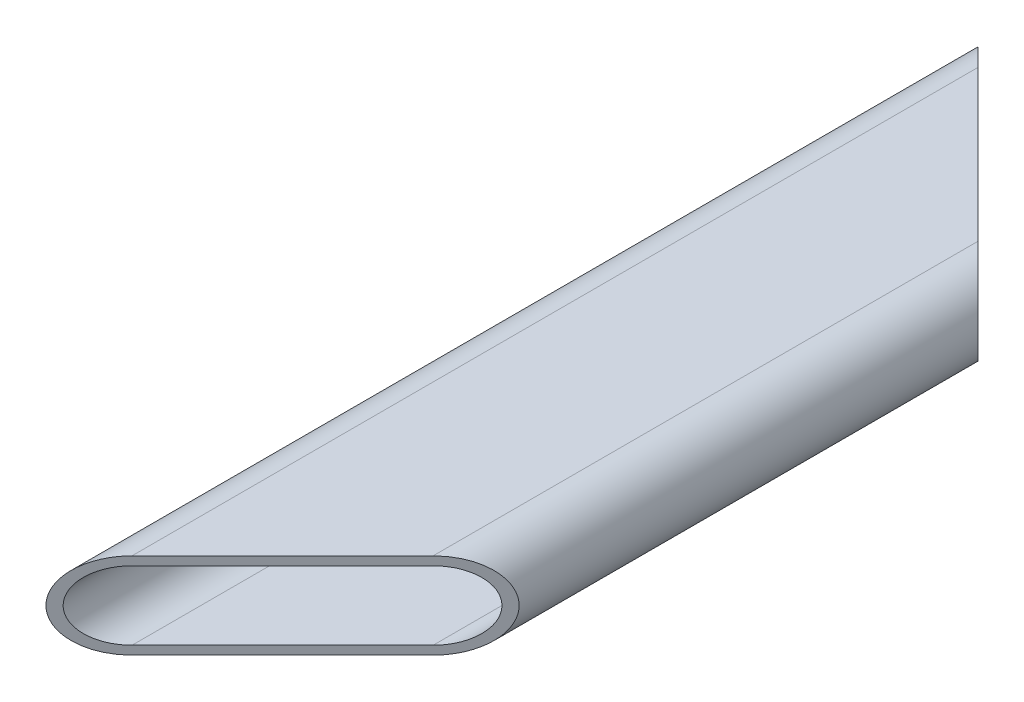
ISO-10303-21;
HEADER;
FILE_DESCRIPTION(('STEP AP214'),'2;1');
FILE_NAME('part.step','',(''),(''),'','','');
FILE_SCHEMA(('AUTOMOTIVE_DESIGN { 1 0 10303 214 1 1 1 1 }'));
ENDSEC;
DATA;
#1=APPLICATION_CONTEXT('core data for automotive mechanical design processes');
#2=APPLICATION_PROTOCOL_DEFINITION('international standard','automotive_design',2000,#1);
#3=PRODUCT_CONTEXT('',#1,'mechanical');
#4=PRODUCT('Part','Part','',(#3));
#5=PRODUCT_RELATED_PRODUCT_CATEGORY('part','',(#4));
#6=PRODUCT_DEFINITION_FORMATION('','',#4);
#7=PRODUCT_DEFINITION_CONTEXT('part definition',#1,'design');
#8=PRODUCT_DEFINITION('design','',#6,#7);
#9=PRODUCT_DEFINITION_SHAPE('','',#8);
#10=(LENGTH_UNIT() NAMED_UNIT(*) SI_UNIT(.MILLI.,.METRE.));
#11=(NAMED_UNIT(*) PLANE_ANGLE_UNIT() SI_UNIT($,.RADIAN.));
#12=(NAMED_UNIT(*) SI_UNIT($,.STERADIAN.) SOLID_ANGLE_UNIT());
#13=UNCERTAINTY_MEASURE_WITH_UNIT(LENGTH_MEASURE(1.E-05),#10,'distance_accuracy_value','');
#14=(GEOMETRIC_REPRESENTATION_CONTEXT(3) GLOBAL_UNCERTAINTY_ASSIGNED_CONTEXT((#13)) GLOBAL_UNIT_ASSIGNED_CONTEXT((#10,
#11,#12)) REPRESENTATION_CONTEXT('',''));
#15=CARTESIAN_POINT('',(0.,0.,0.));
#16=DIRECTION('',(0.,0.,1.));
#17=DIRECTION('',(1.,0.,0.));
#18=AXIS2_PLACEMENT_3D('',#15,#16,#17);
#19=CARTESIAN_POINT('',(0.,0.,130.));
#20=DIRECTION('',(0.,0.,-1.));
#21=DIRECTION('',(-1.,0.,0.));
#22=AXIS2_PLACEMENT_3D('',#19,#20,#21);
#23=CYLINDRICAL_SURFACE('',#22,6.);
#24=DIRECTION('',(0.,0.,-1.));
#25=VECTOR('',#24,1.);
#26=CARTESIAN_POINT('',(0.,-6.,130.));
#27=LINE('',#26,#25);
#28=CARTESIAN_POINT('',(0.,-6.,124.));
#29=VERTEX_POINT('',#28);
#30=CARTESIAN_POINT('',(0.,-6.,5.99999999999991));
#31=VERTEX_POINT('',#30);
#32=EDGE_CURVE('E101',#29,#31,#27,.T.);
#33=ORIENTED_EDGE('',*,*,#32,.F.);
#34=CARTESIAN_POINT('',(0.,0.,124.));
#35=DIRECTION('',(-0.707106781186544,0.,-0.707106781186551));
#36=DIRECTION('',(0.707106781186551,0.,-0.707106781186544));
#37=AXIS2_PLACEMENT_3D('',#34,#35,#36);
#38=ELLIPSE('',#37,8.48528137423853,6.);
#39=CARTESIAN_POINT('',(0.,6.,124.));
#40=VERTEX_POINT('',#39);
#41=EDGE_CURVE('E96',#29,#40,#38,.T.);
#42=ORIENTED_EDGE('',*,*,#41,.T.);
#43=DIRECTION('',(0.,0.,-1.));
#44=VECTOR('',#43,1.);
#45=CARTESIAN_POINT('',(0.,6.,130.));
#46=LINE('',#45,#44);
#47=CARTESIAN_POINT('',(0.,6.,5.99999999999993));
#48=VERTEX_POINT('',#47);
#49=EDGE_CURVE('E99',#40,#48,#46,.T.);
#50=ORIENTED_EDGE('',*,*,#49,.T.);
#51=CARTESIAN_POINT('',(0.,0.,5.99999999999992));
#52=DIRECTION('',(-0.707106781186543,0.,0.707106781186551));
#53=DIRECTION('',(-0.707106781186552,0.,-0.707106781186544));
#54=AXIS2_PLACEMENT_3D('',#51,#52,#53);
#55=ELLIPSE('',#54,8.48528137423852,6.);
#56=EDGE_CURVE('E156',#48,#31,#55,.T.);
#57=ORIENTED_EDGE('',*,*,#56,.T.);
#58=EDGE_LOOP('',(#33,#42,#50,#57));
#59=FACE_BOUND('',#58,.T.);
#60=ADVANCED_FACE('F33',(#59),#23,.T.);
#61=CARTESIAN_POINT('',(0.,-6.,130.));
#62=DIRECTION('',(0.,1.,0.));
#63=DIRECTION('',(0.,0.,1.));
#64=AXIS2_PLACEMENT_3D('',#61,#62,#63);
#65=PLANE('',#64);
#66=DIRECTION('',(0.,0.,-1.));
#67=VECTOR('',#66,1.);
#68=CARTESIAN_POINT('',(21.,-6.,130.));
#69=LINE('',#68,#67);
#70=CARTESIAN_POINT('',(21.,-6.,103.));
#71=VERTEX_POINT('',#70);
#72=CARTESIAN_POINT('',(21.,-6.,26.9999999999997));
#73=VERTEX_POINT('',#72);
#74=EDGE_CURVE('E118',#71,#73,#69,.T.);
#75=ORIENTED_EDGE('',*,*,#74,.F.);
#76=DIRECTION('',(-0.707106781186551,0.,0.707106781186544));
#77=VECTOR('',#76,1.);
#78=CARTESIAN_POINT('',(-2.99999999999997,-6.,127.));
#79=LINE('',#78,#77);
#80=EDGE_CURVE('E104',#71,#29,#79,.T.);
#81=ORIENTED_EDGE('',*,*,#80,.T.);
#82=ORIENTED_EDGE('',*,*,#32,.T.);
#83=DIRECTION('',(0.707106781186552,0.,0.707106781186544));
#84=VECTOR('',#83,1.);
#85=CARTESIAN_POINT('',(62.,-6.,67.9999999999993));
#86=LINE('',#85,#84);
#87=EDGE_CURVE('E149',#31,#73,#86,.T.);
#88=ORIENTED_EDGE('',*,*,#87,.T.);
#89=EDGE_LOOP('',(#75,#81,#82,#88));
#90=FACE_BOUND('',#89,.T.);
#91=ADVANCED_FACE('F184',(#90),#65,.F.);
#92=CARTESIAN_POINT('',(21.,0.,130.));
#93=DIRECTION('',(0.,0.,-1.));
#94=DIRECTION('',(-1.,0.,0.));
#95=AXIS2_PLACEMENT_3D('',#92,#93,#94);
#96=CYLINDRICAL_SURFACE('',#95,6.);
#97=CARTESIAN_POINT('',(21.,0.,103.));
#98=DIRECTION('',(-0.707106781186544,0.,-0.707106781186551));
#99=DIRECTION('',(0.707106781186551,0.,-0.707106781186544));
#100=AXIS2_PLACEMENT_3D('',#97,#98,#99);
#101=ELLIPSE('',#100,8.48528137423853,6.);
#102=CARTESIAN_POINT('',(21.,6.,103.));
#103=VERTEX_POINT('',#102);
#104=EDGE_CURVE('E47',#103,#71,#101,.T.);
#105=ORIENTED_EDGE('',*,*,#104,.T.);
#106=ORIENTED_EDGE('',*,*,#74,.T.);
#107=CARTESIAN_POINT('',(21.,0.,26.9999999999997));
#108=DIRECTION('',(-0.707106781186543,0.,0.707106781186551));
#109=DIRECTION('',(-0.707106781186552,0.,-0.707106781186544));
#110=AXIS2_PLACEMENT_3D('',#107,#108,#109);
#111=ELLIPSE('',#110,8.48528137423852,6.);
#112=CARTESIAN_POINT('',(21.,6.,26.9999999999997));
#113=VERTEX_POINT('',#112);
#114=EDGE_CURVE('E145',#73,#113,#111,.T.);
#115=ORIENTED_EDGE('',*,*,#114,.T.);
#116=DIRECTION('',(0.,0.,-1.));
#117=VECTOR('',#116,1.);
#118=CARTESIAN_POINT('',(21.,6.,130.));
#119=LINE('',#118,#117);
#120=EDGE_CURVE('E115',#103,#113,#119,.T.);
#121=ORIENTED_EDGE('',*,*,#120,.F.);
#122=EDGE_LOOP('',(#105,#106,#115,#121));
#123=FACE_BOUND('',#122,.T.);
#124=ADVANCED_FACE('F188',(#123),#96,.T.);
#125=CARTESIAN_POINT('',(0.,6.,130.));
#126=DIRECTION('',(0.,-1.,0.));
#127=DIRECTION('',(0.,0.,-1.));
#128=AXIS2_PLACEMENT_3D('',#125,#126,#127);
#129=PLANE('',#128);
#130=ORIENTED_EDGE('',*,*,#49,.F.);
#131=DIRECTION('',(-0.707106781186551,0.,0.707106781186544));
#132=VECTOR('',#131,1.);
#133=CARTESIAN_POINT('',(-6.,6.,130.));
#134=LINE('',#133,#132);
#135=EDGE_CURVE('E106',#103,#40,#134,.T.);
#136=ORIENTED_EDGE('',*,*,#135,.F.);
#137=ORIENTED_EDGE('',*,*,#120,.T.);
#138=DIRECTION('',(0.707106781186551,0.,0.707106781186543));
#139=VECTOR('',#138,1.);
#140=CARTESIAN_POINT('',(-6.,6.,0.));
#141=LINE('',#140,#139);
#142=EDGE_CURVE('E103',#48,#113,#141,.T.);
#143=ORIENTED_EDGE('',*,*,#142,.F.);
#144=EDGE_LOOP('',(#130,#136,#137,#143));
#145=FACE_BOUND('',#144,.T.);
#146=ADVANCED_FACE('F113',(#145),#129,.F.);
#147=CARTESIAN_POINT('',(0.,0.,130.));
#148=DIRECTION('',(0.,0.,-1.));
#149=DIRECTION('',(-1.,0.,0.));
#150=AXIS2_PLACEMENT_3D('',#147,#148,#149);
#151=CYLINDRICAL_SURFACE('',#150,4.8);
#152=CARTESIAN_POINT('',(0.,0.,124.));
#153=DIRECTION('',(-0.707106781186544,0.,-0.707106781186551));
#154=DIRECTION('',(0.707106781186551,0.,-0.707106781186544));
#155=AXIS2_PLACEMENT_3D('',#152,#153,#154);
#156=ELLIPSE('',#155,6.78822509939082,4.8);
#157=CARTESIAN_POINT('',(0.,-4.8,124.));
#158=VERTEX_POINT('',#157);
#159=CARTESIAN_POINT('',(0.,4.8,124.));
#160=VERTEX_POINT('',#159);
#161=EDGE_CURVE('E54',#158,#160,#156,.T.);
#162=ORIENTED_EDGE('',*,*,#161,.F.);
#163=DIRECTION('',(0.,0.,-1.));
#164=VECTOR('',#163,1.);
#165=CARTESIAN_POINT('',(0.,-4.8,130.));
#166=LINE('',#165,#164);
#167=CARTESIAN_POINT('',(0.,-4.8,5.99999999999991));
#168=VERTEX_POINT('',#167);
#169=EDGE_CURVE('E116',#158,#168,#166,.T.);
#170=ORIENTED_EDGE('',*,*,#169,.T.);
#171=CARTESIAN_POINT('',(0.,0.,5.99999999999992));
#172=DIRECTION('',(-0.707106781186543,0.,0.707106781186551));
#173=DIRECTION('',(-0.707106781186552,0.,-0.707106781186544));
#174=AXIS2_PLACEMENT_3D('',#171,#172,#173);
#175=ELLIPSE('',#174,6.78822509939082,4.8);
#176=CARTESIAN_POINT('',(0.,4.8,5.99999999999991));
#177=VERTEX_POINT('',#176);
#178=EDGE_CURVE('E134',#177,#168,#175,.T.);
#179=ORIENTED_EDGE('',*,*,#178,.F.);
#180=DIRECTION('',(0.,0.,-1.));
#181=VECTOR('',#180,1.);
#182=CARTESIAN_POINT('',(0.,4.8,130.));
#183=LINE('',#182,#181);
#184=EDGE_CURVE('E143',#160,#177,#183,.T.);
#185=ORIENTED_EDGE('',*,*,#184,.F.);
#186=EDGE_LOOP('',(#162,#170,#179,#185));
#187=FACE_BOUND('',#186,.T.);
#188=ADVANCED_FACE('F142',(#187),#151,.F.);
#189=CARTESIAN_POINT('',(0.,-4.8,130.));
#190=DIRECTION('',(0.,1.,0.));
#191=DIRECTION('',(0.,0.,1.));
#192=AXIS2_PLACEMENT_3D('',#189,#190,#191);
#193=PLANE('',#192);
#194=DIRECTION('',(-0.707106781186551,0.,0.707106781186544));
#195=VECTOR('',#194,1.);
#196=CARTESIAN_POINT('',(-2.99999999999997,-4.8,127.));
#197=LINE('',#196,#195);
#198=CARTESIAN_POINT('',(21.,-4.8,103.));
#199=VERTEX_POINT('',#198);
#200=EDGE_CURVE('E164',#199,#158,#197,.T.);
#201=ORIENTED_EDGE('',*,*,#200,.F.);
#202=DIRECTION('',(0.,0.,-1.));
#203=VECTOR('',#202,1.);
#204=CARTESIAN_POINT('',(21.,-4.8,130.));
#205=LINE('',#204,#203);
#206=CARTESIAN_POINT('',(21.,-4.8,26.9999999999997));
#207=VERTEX_POINT('',#206);
#208=EDGE_CURVE('E120',#199,#207,#205,.T.);
#209=ORIENTED_EDGE('',*,*,#208,.T.);
#210=DIRECTION('',(0.707106781186552,0.,0.707106781186544));
#211=VECTOR('',#210,1.);
#212=CARTESIAN_POINT('',(62.,-4.8,67.9999999999993));
#213=LINE('',#212,#211);
#214=EDGE_CURVE('E146',#168,#207,#213,.T.);
#215=ORIENTED_EDGE('',*,*,#214,.F.);
#216=ORIENTED_EDGE('',*,*,#169,.F.);
#217=EDGE_LOOP('',(#201,#209,#215,#216));
#218=FACE_BOUND('',#217,.T.);
#219=ADVANCED_FACE('F163',(#218),#193,.T.);
#220=CARTESIAN_POINT('',(21.,0.,130.));
#221=DIRECTION('',(0.,0.,-1.));
#222=DIRECTION('',(-1.,0.,0.));
#223=AXIS2_PLACEMENT_3D('',#220,#221,#222);
#224=CYLINDRICAL_SURFACE('',#223,4.8);
#225=CARTESIAN_POINT('',(21.,0.,103.));
#226=DIRECTION('',(-0.707106781186544,0.,-0.707106781186551));
#227=DIRECTION('',(0.707106781186551,0.,-0.707106781186544));
#228=AXIS2_PLACEMENT_3D('',#225,#226,#227);
#229=ELLIPSE('',#228,6.78822509939082,4.8);
#230=CARTESIAN_POINT('',(21.,4.8,103.));
#231=VERTEX_POINT('',#230);
#232=EDGE_CURVE('E110',#231,#199,#229,.T.);
#233=ORIENTED_EDGE('',*,*,#232,.F.);
#234=DIRECTION('',(0.,0.,-1.));
#235=VECTOR('',#234,1.);
#236=CARTESIAN_POINT('',(21.,4.8,130.));
#237=LINE('',#236,#235);
#238=CARTESIAN_POINT('',(21.,4.8,26.9999999999997));
#239=VERTEX_POINT('',#238);
#240=EDGE_CURVE('E159',#231,#239,#237,.T.);
#241=ORIENTED_EDGE('',*,*,#240,.T.);
#242=CARTESIAN_POINT('',(21.,0.,26.9999999999997));
#243=DIRECTION('',(-0.707106781186543,0.,0.707106781186551));
#244=DIRECTION('',(-0.707106781186552,0.,-0.707106781186544));
#245=AXIS2_PLACEMENT_3D('',#242,#243,#244);
#246=ELLIPSE('',#245,6.78822509939082,4.8);
#247=EDGE_CURVE('E137',#207,#239,#246,.T.);
#248=ORIENTED_EDGE('',*,*,#247,.F.);
#249=ORIENTED_EDGE('',*,*,#208,.F.);
#250=EDGE_LOOP('',(#233,#241,#248,#249));
#251=FACE_BOUND('',#250,.T.);
#252=ADVANCED_FACE('F167',(#251),#224,.F.);
#253=CARTESIAN_POINT('',(0.,4.8,130.));
#254=DIRECTION('',(0.,-1.,0.));
#255=DIRECTION('',(0.,0.,-1.));
#256=AXIS2_PLACEMENT_3D('',#253,#254,#255);
#257=PLANE('',#256);
#258=DIRECTION('',(0.707106781186551,0.,-0.707106781186544));
#259=VECTOR('',#258,1.);
#260=CARTESIAN_POINT('',(-2.99999999999997,4.8,127.));
#261=LINE('',#260,#259);
#262=EDGE_CURVE('E11',#160,#231,#261,.T.);
#263=ORIENTED_EDGE('',*,*,#262,.F.);
#264=ORIENTED_EDGE('',*,*,#184,.T.);
#265=DIRECTION('',(-0.707106781186552,0.,-0.707106781186544));
#266=VECTOR('',#265,1.);
#267=CARTESIAN_POINT('',(62.,4.8,67.9999999999993));
#268=LINE('',#267,#266);
#269=EDGE_CURVE('E40',#239,#177,#268,.T.);
#270=ORIENTED_EDGE('',*,*,#269,.F.);
#271=ORIENTED_EDGE('',*,*,#240,.F.);
#272=EDGE_LOOP('',(#263,#264,#270,#271));
#273=FACE_BOUND('',#272,.T.);
#274=ADVANCED_FACE('F174',(#273),#257,.T.);
#275=CARTESIAN_POINT('',(-6.,-24.,0.));
#276=DIRECTION('',(-0.707106781186543,0.,0.707106781186551));
#277=DIRECTION('',(0.707106781186552,0.,0.707106781186544));
#278=AXIS2_PLACEMENT_3D('',#275,#276,#277);
#279=PLANE('',#278);
#280=ORIENTED_EDGE('',*,*,#178,.T.);
#281=ORIENTED_EDGE('',*,*,#214,.T.);
#282=ORIENTED_EDGE('',*,*,#247,.T.);
#283=ORIENTED_EDGE('',*,*,#269,.T.);
#284=EDGE_LOOP('',(#280,#281,#282,#283));
#285=FACE_BOUND('',#284,.T.);
#286=ORIENTED_EDGE('',*,*,#142,.T.);
#287=ORIENTED_EDGE('',*,*,#114,.F.);
#288=ORIENTED_EDGE('',*,*,#87,.F.);
#289=ORIENTED_EDGE('',*,*,#56,.F.);
#290=EDGE_LOOP('',(#286,#287,#288,#289));
#291=FACE_BOUND('',#290,.T.);
#292=ADVANCED_FACE('F131',(#285,#291),#279,.F.);
#293=CARTESIAN_POINT('',(-6.,-24.,130.));
#294=DIRECTION('',(-0.707106781186544,0.,-0.707106781186551));
#295=DIRECTION('',(-0.707106781186551,0.,0.707106781186544));
#296=AXIS2_PLACEMENT_3D('',#293,#294,#295);
#297=PLANE('',#296);
#298=ORIENTED_EDGE('',*,*,#161,.T.);
#299=ORIENTED_EDGE('',*,*,#262,.T.);
#300=ORIENTED_EDGE('',*,*,#232,.T.);
#301=ORIENTED_EDGE('',*,*,#200,.T.);
#302=EDGE_LOOP('',(#298,#299,#300,#301));
#303=FACE_BOUND('',#302,.T.);
#304=ORIENTED_EDGE('',*,*,#41,.F.);
#305=ORIENTED_EDGE('',*,*,#80,.F.);
#306=ORIENTED_EDGE('',*,*,#104,.F.);
#307=ORIENTED_EDGE('',*,*,#135,.T.);
#308=EDGE_LOOP('',(#304,#305,#306,#307));
#309=FACE_BOUND('',#308,.T.);
#310=ADVANCED_FACE('F107',(#303,#309),#297,.F.);
#311=CLOSED_SHELL('',(#60,#91,#124,#146,#188,#219,#252,#274,#292,#310));
#312=MANIFOLD_SOLID_BREP('B2',#311);
#313=ADVANCED_BREP_SHAPE_REPRESENTATION('',(#18,#312),#14);
#314=SHAPE_DEFINITION_REPRESENTATION(#9,#313);
ENDSEC;
END-ISO-10303-21;
